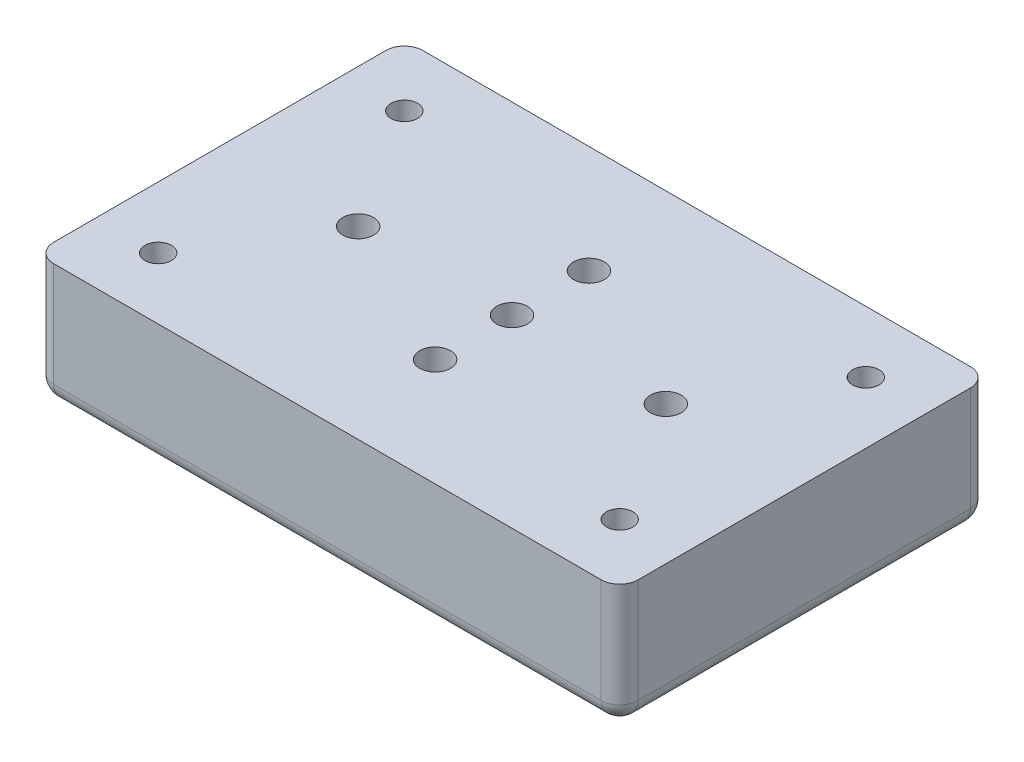
ISO-10303-21;
HEADER;
FILE_DESCRIPTION(('STEP AP214'),'2;1');
FILE_NAME('part.step','',(''),(''),'','','');
FILE_SCHEMA(('AUTOMOTIVE_DESIGN { 1 0 10303 214 1 1 1 1 }'));
ENDSEC;
DATA;
#1=APPLICATION_CONTEXT('core data for automotive mechanical design processes');
#2=APPLICATION_PROTOCOL_DEFINITION('international standard','automotive_design',2000,#1);
#3=PRODUCT_CONTEXT('',#1,'mechanical');
#4=PRODUCT('Part','Part','',(#3));
#5=PRODUCT_RELATED_PRODUCT_CATEGORY('part','',(#4));
#6=PRODUCT_DEFINITION_FORMATION('','',#4);
#7=PRODUCT_DEFINITION_CONTEXT('part definition',#1,'design');
#8=PRODUCT_DEFINITION('design','',#6,#7);
#9=PRODUCT_DEFINITION_SHAPE('','',#8);
#10=(LENGTH_UNIT() NAMED_UNIT(*) SI_UNIT(.MILLI.,.METRE.));
#11=(NAMED_UNIT(*) PLANE_ANGLE_UNIT() SI_UNIT($,.RADIAN.));
#12=(NAMED_UNIT(*) SI_UNIT($,.STERADIAN.) SOLID_ANGLE_UNIT());
#13=UNCERTAINTY_MEASURE_WITH_UNIT(LENGTH_MEASURE(1.E-05),#10,'distance_accuracy_value','');
#14=(GEOMETRIC_REPRESENTATION_CONTEXT(3) GLOBAL_UNCERTAINTY_ASSIGNED_CONTEXT((#13)) GLOBAL_UNIT_ASSIGNED_CONTEXT((#10,
#11,#12)) REPRESENTATION_CONTEXT('',''));
#15=CARTESIAN_POINT('',(0.,0.,0.));
#16=DIRECTION('',(0.,0.,1.));
#17=DIRECTION('',(1.,0.,0.));
#18=AXIS2_PLACEMENT_3D('',#15,#16,#17);
#19=CARTESIAN_POINT('',(-102.520594586842,20.,50.7506198442389));
#20=DIRECTION('',(1.,0.,0.));
#21=DIRECTION('',(0.,0.,-1.));
#22=AXIS2_PLACEMENT_3D('',#19,#20,#21);
#23=PLANE('',#22);
#24=DIRECTION('',(0.,0.,1.));
#25=VECTOR('',#24,1.);
#26=CARTESIAN_POINT('',(-102.520594586842,20.,50.7506198442389));
#27=LINE('',#26,#25);
#28=CARTESIAN_POINT('',(-102.520594586842,20.,53.7506198442389));
#29=VERTEX_POINT('',#28);
#30=CARTESIAN_POINT('',(-102.520594586842,20.,107.750619844239));
#31=VERTEX_POINT('',#30);
#32=EDGE_CURVE('E283',#29,#31,#27,.T.);
#33=ORIENTED_EDGE('',*,*,#32,.F.);
#34=DIRECTION('',(0.,-1.,0.));
#35=VECTOR('',#34,1.);
#36=CARTESIAN_POINT('',(-102.520594586842,20.,53.7506198442389));
#37=LINE('',#36,#35);
#38=CARTESIAN_POINT('',(-102.520594586842,3.,53.7506198442389));
#39=VERTEX_POINT('',#38);
#40=EDGE_CURVE('E155',#29,#39,#37,.T.);
#41=ORIENTED_EDGE('',*,*,#40,.T.);
#42=DIRECTION('',(0.,0.,1.));
#43=VECTOR('',#42,1.);
#44=CARTESIAN_POINT('',(-102.520594586842,3.,50.7506198442389));
#45=LINE('',#44,#43);
#46=CARTESIAN_POINT('',(-102.520594586842,3.,107.750619844239));
#47=VERTEX_POINT('',#46);
#48=EDGE_CURVE('E124',#39,#47,#45,.T.);
#49=ORIENTED_EDGE('',*,*,#48,.T.);
#50=DIRECTION('',(0.,-1.,0.));
#51=VECTOR('',#50,1.);
#52=CARTESIAN_POINT('',(-102.520594586842,20.,107.750619844239));
#53=LINE('',#52,#51);
#54=EDGE_CURVE('E153',#47,#31,#53,.F.);
#55=ORIENTED_EDGE('',*,*,#54,.T.);
#56=EDGE_LOOP('',(#33,#41,#49,#55));
#57=FACE_BOUND('',#56,.T.);
#58=ADVANCED_FACE('F33',(#57),#23,.F.);
#59=CARTESIAN_POINT('',(-102.520594586842,20.,110.750619844239));
#60=DIRECTION('',(0.,0.,-1.));
#61=DIRECTION('',(-1.,0.,0.));
#62=AXIS2_PLACEMENT_3D('',#59,#60,#61);
#63=PLANE('',#62);
#64=DIRECTION('',(1.,0.,0.));
#65=VECTOR('',#64,1.);
#66=CARTESIAN_POINT('',(-102.520594586842,3.,110.750619844239));
#67=LINE('',#66,#65);
#68=CARTESIAN_POINT('',(-99.520594586842,3.,110.750619844239));
#69=VERTEX_POINT('',#68);
#70=CARTESIAN_POINT('',(-10.520594586842,3.,110.750619844239));
#71=VERTEX_POINT('',#70);
#72=EDGE_CURVE('E157',#69,#71,#67,.T.);
#73=ORIENTED_EDGE('',*,*,#72,.T.);
#74=DIRECTION('',(0.,-1.,0.));
#75=VECTOR('',#74,1.);
#76=CARTESIAN_POINT('',(-10.520594586842,20.,110.750619844239));
#77=LINE('',#76,#75);
#78=CARTESIAN_POINT('',(-10.520594586842,20.,110.750619844239));
#79=VERTEX_POINT('',#78);
#80=EDGE_CURVE('E161',#71,#79,#77,.F.);
#81=ORIENTED_EDGE('',*,*,#80,.T.);
#82=DIRECTION('',(1.,0.,0.));
#83=VECTOR('',#82,1.);
#84=CARTESIAN_POINT('',(-102.520594586842,20.,110.750619844239));
#85=LINE('',#84,#83);
#86=CARTESIAN_POINT('',(-99.520594586842,20.,110.750619844239));
#87=VERTEX_POINT('',#86);
#88=EDGE_CURVE('E286',#87,#79,#85,.T.);
#89=ORIENTED_EDGE('',*,*,#88,.F.);
#90=DIRECTION('',(0.,-1.,0.));
#91=VECTOR('',#90,1.);
#92=CARTESIAN_POINT('',(-99.520594586842,20.,110.750619844239));
#93=LINE('',#92,#91);
#94=EDGE_CURVE('E159',#87,#69,#93,.T.);
#95=ORIENTED_EDGE('',*,*,#94,.T.);
#96=EDGE_LOOP('',(#73,#81,#89,#95));
#97=FACE_BOUND('',#96,.T.);
#98=ADVANCED_FACE('F313',(#97),#63,.F.);
#99=CARTESIAN_POINT('',(-7.52059458684204,20.,50.7506198442389));
#100=DIRECTION('',(-1.,0.,0.));
#101=DIRECTION('',(0.,0.,1.));
#102=AXIS2_PLACEMENT_3D('',#99,#100,#101);
#103=PLANE('',#102);
#104=DIRECTION('',(0.,0.,-1.));
#105=VECTOR('',#104,1.);
#106=CARTESIAN_POINT('',(-7.52059458684204,3.,50.7506198442389));
#107=LINE('',#106,#105);
#108=CARTESIAN_POINT('',(-7.52059458684201,3.,107.750619844239));
#109=VERTEX_POINT('',#108);
#110=CARTESIAN_POINT('',(-7.52059458684204,3.,53.7506198442389));
#111=VERTEX_POINT('',#110);
#112=EDGE_CURVE('E137',#109,#111,#107,.T.);
#113=ORIENTED_EDGE('',*,*,#112,.T.);
#114=DIRECTION('',(0.,-1.,0.));
#115=VECTOR('',#114,1.);
#116=CARTESIAN_POINT('',(-7.52059458684204,20.,53.7506198442389));
#117=LINE('',#116,#115);
#118=CARTESIAN_POINT('',(-7.52059458684204,20.,53.7506198442389));
#119=VERTEX_POINT('',#118);
#120=EDGE_CURVE('E145',#111,#119,#117,.F.);
#121=ORIENTED_EDGE('',*,*,#120,.T.);
#122=DIRECTION('',(0.,0.,-1.));
#123=VECTOR('',#122,1.);
#124=CARTESIAN_POINT('',(-7.52059458684204,20.,50.7506198442389));
#125=LINE('',#124,#123);
#126=CARTESIAN_POINT('',(-7.52059458684201,20.,107.750619844239));
#127=VERTEX_POINT('',#126);
#128=EDGE_CURVE('E120',#127,#119,#125,.T.);
#129=ORIENTED_EDGE('',*,*,#128,.F.);
#130=DIRECTION('',(0.,-1.,0.));
#131=VECTOR('',#130,1.);
#132=CARTESIAN_POINT('',(-7.52059458684201,20.,107.750619844239));
#133=LINE('',#132,#131);
#134=EDGE_CURVE('E139',#127,#109,#133,.T.);
#135=ORIENTED_EDGE('',*,*,#134,.T.);
#136=EDGE_LOOP('',(#113,#121,#129,#135));
#137=FACE_BOUND('',#136,.T.);
#138=ADVANCED_FACE('F330',(#137),#103,.F.);
#139=CARTESIAN_POINT('',(-102.520594586842,20.,50.7506198442389));
#140=DIRECTION('',(0.,0.,1.));
#141=DIRECTION('',(1.,0.,0.));
#142=AXIS2_PLACEMENT_3D('',#139,#140,#141);
#143=PLANE('',#142);
#144=DIRECTION('',(-1.,0.,0.));
#145=VECTOR('',#144,1.);
#146=CARTESIAN_POINT('',(-102.520594586842,20.,50.7506198442389));
#147=LINE('',#146,#145);
#148=CARTESIAN_POINT('',(-10.520594586842,20.,50.7506198442389));
#149=VERTEX_POINT('',#148);
#150=CARTESIAN_POINT('',(-99.520594586842,20.,50.7506198442389));
#151=VERTEX_POINT('',#150);
#152=EDGE_CURVE('E117',#149,#151,#147,.T.);
#153=ORIENTED_EDGE('',*,*,#152,.F.);
#154=DIRECTION('',(0.,-1.,0.));
#155=VECTOR('',#154,1.);
#156=CARTESIAN_POINT('',(-10.520594586842,20.,50.7506198442389));
#157=LINE('',#156,#155);
#158=CARTESIAN_POINT('',(-10.520594586842,3.,50.7506198442389));
#159=VERTEX_POINT('',#158);
#160=EDGE_CURVE('E130',#149,#159,#157,.T.);
#161=ORIENTED_EDGE('',*,*,#160,.T.);
#162=DIRECTION('',(-1.,0.,0.));
#163=VECTOR('',#162,1.);
#164=CARTESIAN_POINT('',(-102.520594586842,3.,50.7506198442389));
#165=LINE('',#164,#163);
#166=CARTESIAN_POINT('',(-99.520594586842,3.,50.7506198442389));
#167=VERTEX_POINT('',#166);
#168=EDGE_CURVE('E133',#159,#167,#165,.T.);
#169=ORIENTED_EDGE('',*,*,#168,.T.);
#170=DIRECTION('',(0.,-1.,0.));
#171=VECTOR('',#170,1.);
#172=CARTESIAN_POINT('',(-99.520594586842,20.,50.7506198442389));
#173=LINE('',#172,#171);
#174=EDGE_CURVE('E132',#167,#151,#173,.F.);
#175=ORIENTED_EDGE('',*,*,#174,.T.);
#176=EDGE_LOOP('',(#153,#161,#169,#175));
#177=FACE_BOUND('',#176,.T.);
#178=ADVANCED_FACE('F129',(#177),#143,.F.);
#179=CARTESIAN_POINT('',(0.,20.,0.));
#180=DIRECTION('',(0.,1.,0.));
#181=DIRECTION('',(0.,0.,1.));
#182=AXIS2_PLACEMENT_3D('',#179,#180,#181);
#183=PLANE('',#182);
#184=CARTESIAN_POINT('',(-30.020594586842,20.,80.7506198442389));
#185=DIRECTION('',(0.,-1.,0.));
#186=DIRECTION('',(0.,0.,-1.));
#187=AXIS2_PLACEMENT_3D('',#184,#185,#186);
#188=CIRCLE('',#187,2.5);
#189=CARTESIAN_POINT('',(-30.020594586842,20.,78.2506198442389));
#190=VERTEX_POINT('',#189);
#191=EDGE_CURVE('E204',#190,#190,#188,.T.);
#192=ORIENTED_EDGE('',*,*,#191,.T.);
#193=EDGE_LOOP('',(#192));
#194=FACE_BOUND('',#193,.T.);
#195=CARTESIAN_POINT('',(-55.020594586842,20.,80.7506198442389));
#196=DIRECTION('',(0.,-1.,0.));
#197=DIRECTION('',(0.,0.,-1.));
#198=AXIS2_PLACEMENT_3D('',#195,#196,#197);
#199=CIRCLE('',#198,2.5);
#200=CARTESIAN_POINT('',(-55.020594586842,20.,78.2506198442389));
#201=VERTEX_POINT('',#200);
#202=EDGE_CURVE('E214',#201,#201,#199,.T.);
#203=ORIENTED_EDGE('',*,*,#202,.T.);
#204=EDGE_LOOP('',(#203));
#205=FACE_BOUND('',#204,.T.);
#206=CARTESIAN_POINT('',(-80.020594586842,20.,80.7506198442389));
#207=DIRECTION('',(0.,-1.,0.));
#208=DIRECTION('',(0.,0.,-1.));
#209=AXIS2_PLACEMENT_3D('',#206,#207,#208);
#210=CIRCLE('',#209,2.5);
#211=CARTESIAN_POINT('',(-80.020594586842,20.,78.2506198442389));
#212=VERTEX_POINT('',#211);
#213=EDGE_CURVE('E220',#212,#212,#210,.T.);
#214=ORIENTED_EDGE('',*,*,#213,.T.);
#215=EDGE_LOOP('',(#214));
#216=FACE_BOUND('',#215,.T.);
#217=CARTESIAN_POINT('',(-55.020594586842,20.,68.2506198442389));
#218=DIRECTION('',(0.,-1.,0.));
#219=DIRECTION('',(0.,0.,-1.));
#220=AXIS2_PLACEMENT_3D('',#217,#218,#219);
#221=CIRCLE('',#220,2.5);
#222=CARTESIAN_POINT('',(-55.020594586842,20.,65.7506198442389));
#223=VERTEX_POINT('',#222);
#224=EDGE_CURVE('E226',#223,#223,#221,.T.);
#225=ORIENTED_EDGE('',*,*,#224,.T.);
#226=EDGE_LOOP('',(#225));
#227=FACE_BOUND('',#226,.T.);
#228=CARTESIAN_POINT('',(-55.020594586842,20.,93.2506198442389));
#229=DIRECTION('',(0.,-1.,0.));
#230=DIRECTION('',(0.,0.,-1.));
#231=AXIS2_PLACEMENT_3D('',#228,#229,#230);
#232=CIRCLE('',#231,2.5);
#233=CARTESIAN_POINT('',(-55.020594586842,20.,90.7506198442389));
#234=VERTEX_POINT('',#233);
#235=EDGE_CURVE('E232',#234,#234,#232,.T.);
#236=ORIENTED_EDGE('',*,*,#235,.T.);
#237=EDGE_LOOP('',(#236));
#238=FACE_BOUND('',#237,.T.);
#239=CARTESIAN_POINT('',(-17.520594586842,20.,60.7506198442389));
#240=DIRECTION('',(0.,-1.,0.));
#241=DIRECTION('',(0.,0.,-1.));
#242=AXIS2_PLACEMENT_3D('',#239,#240,#241);
#243=CIRCLE('',#242,2.15);
#244=CARTESIAN_POINT('',(-17.520594586842,20.,58.6006198442389));
#245=VERTEX_POINT('',#244);
#246=EDGE_CURVE('E244',#245,#245,#243,.T.);
#247=ORIENTED_EDGE('',*,*,#246,.T.);
#248=EDGE_LOOP('',(#247));
#249=FACE_BOUND('',#248,.T.);
#250=CARTESIAN_POINT('',(-92.5205945868421,20.,60.7506198442389));
#251=DIRECTION('',(0.,-1.,0.));
#252=DIRECTION('',(0.,0.,-1.));
#253=AXIS2_PLACEMENT_3D('',#250,#251,#252);
#254=CIRCLE('',#253,2.15);
#255=CARTESIAN_POINT('',(-92.5205945868421,20.,58.6006198442389));
#256=VERTEX_POINT('',#255);
#257=EDGE_CURVE('E256',#256,#256,#254,.T.);
#258=ORIENTED_EDGE('',*,*,#257,.T.);
#259=EDGE_LOOP('',(#258));
#260=FACE_BOUND('',#259,.T.);
#261=CARTESIAN_POINT('',(-92.5205945868421,20.,100.750619844239));
#262=DIRECTION('',(0.,-1.,0.));
#263=DIRECTION('',(0.,0.,-1.));
#264=AXIS2_PLACEMENT_3D('',#261,#262,#263);
#265=CIRCLE('',#264,2.15);
#266=CARTESIAN_POINT('',(-92.5205945868421,20.,98.6006198442389));
#267=VERTEX_POINT('',#266);
#268=EDGE_CURVE('E268',#267,#267,#265,.T.);
#269=ORIENTED_EDGE('',*,*,#268,.T.);
#270=EDGE_LOOP('',(#269));
#271=FACE_BOUND('',#270,.T.);
#272=CARTESIAN_POINT('',(-17.520594586842,20.,100.750619844239));
#273=DIRECTION('',(0.,-1.,0.));
#274=DIRECTION('',(0.,0.,-1.));
#275=AXIS2_PLACEMENT_3D('',#272,#273,#274);
#276=CIRCLE('',#275,2.15);
#277=CARTESIAN_POINT('',(-17.520594586842,20.,98.6006198442389));
#278=VERTEX_POINT('',#277);
#279=EDGE_CURVE('E280',#278,#278,#276,.T.);
#280=ORIENTED_EDGE('',*,*,#279,.T.);
#281=EDGE_LOOP('',(#280));
#282=FACE_BOUND('',#281,.T.);
#283=ORIENTED_EDGE('',*,*,#128,.T.);
#284=CARTESIAN_POINT('',(-10.520594586842,20.,53.7506198442389));
#285=DIRECTION('',(0.,1.,0.));
#286=DIRECTION('',(0.,0.,1.));
#287=AXIS2_PLACEMENT_3D('',#284,#285,#286);
#288=CIRCLE('',#287,3.);
#289=EDGE_CURVE('E114',#119,#149,#288,.T.);
#290=ORIENTED_EDGE('',*,*,#289,.T.);
#291=ORIENTED_EDGE('',*,*,#152,.T.);
#292=CARTESIAN_POINT('',(-99.520594586842,20.,53.7506198442389));
#293=DIRECTION('',(0.,1.,0.));
#294=DIRECTION('',(0.,0.,1.));
#295=AXIS2_PLACEMENT_3D('',#292,#293,#294);
#296=CIRCLE('',#295,3.);
#297=EDGE_CURVE('E125',#151,#29,#296,.T.);
#298=ORIENTED_EDGE('',*,*,#297,.T.);
#299=ORIENTED_EDGE('',*,*,#32,.T.);
#300=CARTESIAN_POINT('',(-99.520594586842,20.,107.750619844239));
#301=DIRECTION('',(0.,1.,0.));
#302=DIRECTION('',(0.,0.,1.));
#303=AXIS2_PLACEMENT_3D('',#300,#301,#302);
#304=CIRCLE('',#303,3.);
#305=EDGE_CURVE('E147',#31,#87,#304,.T.);
#306=ORIENTED_EDGE('',*,*,#305,.T.);
#307=ORIENTED_EDGE('',*,*,#88,.T.);
#308=CARTESIAN_POINT('',(-10.520594586842,20.,107.750619844239));
#309=DIRECTION('',(0.,1.,0.));
#310=DIRECTION('',(0.,0.,1.));
#311=AXIS2_PLACEMENT_3D('',#308,#309,#310);
#312=CIRCLE('',#311,3.);
#313=EDGE_CURVE('E149',#79,#127,#312,.T.);
#314=ORIENTED_EDGE('',*,*,#313,.T.);
#315=EDGE_LOOP('',(#283,#290,#291,#298,#299,#306,#307,#314));
#316=FACE_BOUND('',#315,.T.);
#317=ADVANCED_FACE('F116',(#194,#205,#216,#227,#238,#249,#260,#271,#282,#316),#183,.T.);
#318=CARTESIAN_POINT('',(0.,0.,0.));
#319=DIRECTION('',(0.,1.,0.));
#320=DIRECTION('',(0.,0.,1.));
#321=AXIS2_PLACEMENT_3D('',#318,#319,#320);
#322=PLANE('',#321);
#323=DIRECTION('',(0.,0.,1.));
#324=VECTOR('',#323,1.);
#325=CARTESIAN_POINT('',(-99.520594586842,0.,0.));
#326=LINE('',#325,#324);
#327=CARTESIAN_POINT('',(-99.520594586842,0.,107.750619844239));
#328=VERTEX_POINT('',#327);
#329=CARTESIAN_POINT('',(-99.520594586842,0.,53.7506198442389));
#330=VERTEX_POINT('',#329);
#331=EDGE_CURVE('E163',#328,#330,#326,.F.);
#332=ORIENTED_EDGE('',*,*,#331,.T.);
#333=DIRECTION('',(-1.,0.,0.));
#334=VECTOR('',#333,1.);
#335=CARTESIAN_POINT('',(0.,0.,53.7506198442389));
#336=LINE('',#335,#334);
#337=CARTESIAN_POINT('',(-10.520594586842,0.,53.7506198442389));
#338=VERTEX_POINT('',#337);
#339=EDGE_CURVE('E11',#330,#338,#336,.F.);
#340=ORIENTED_EDGE('',*,*,#339,.T.);
#341=DIRECTION('',(0.,0.,-1.));
#342=VECTOR('',#341,1.);
#343=CARTESIAN_POINT('',(-10.5205945868421,0.,0.));
#344=LINE('',#343,#342);
#345=CARTESIAN_POINT('',(-10.520594586842,0.,107.750619844239));
#346=VERTEX_POINT('',#345);
#347=EDGE_CURVE('E42',#338,#346,#344,.F.);
#348=ORIENTED_EDGE('',*,*,#347,.T.);
#349=DIRECTION('',(1.,0.,0.));
#350=VECTOR('',#349,1.);
#351=CARTESIAN_POINT('',(0.,0.,107.750619844239));
#352=LINE('',#351,#350);
#353=EDGE_CURVE('E165',#346,#328,#352,.F.);
#354=ORIENTED_EDGE('',*,*,#353,.T.);
#355=EDGE_LOOP('',(#332,#340,#348,#354));
#356=FACE_BOUND('',#355,.T.);
#357=CARTESIAN_POINT('',(-30.020594586842,0.,80.7506198442389));
#358=DIRECTION('',(0.,-1.,0.));
#359=DIRECTION('',(0.,0.,-1.));
#360=AXIS2_PLACEMENT_3D('',#357,#358,#359);
#361=CIRCLE('',#360,2.5);
#362=CARTESIAN_POINT('',(-30.020594586842,0.,78.2506198442389));
#363=VERTEX_POINT('',#362);
#364=EDGE_CURVE('E199',#363,#363,#361,.T.);
#365=ORIENTED_EDGE('',*,*,#364,.F.);
#366=EDGE_LOOP('',(#365));
#367=FACE_BOUND('',#366,.T.);
#368=CARTESIAN_POINT('',(-55.020594586842,0.,80.7506198442389));
#369=DIRECTION('',(0.,-1.,0.));
#370=DIRECTION('',(0.,0.,-1.));
#371=AXIS2_PLACEMENT_3D('',#368,#369,#370);
#372=CIRCLE('',#371,2.5);
#373=CARTESIAN_POINT('',(-55.020594586842,0.,78.2506198442389));
#374=VERTEX_POINT('',#373);
#375=EDGE_CURVE('E209',#374,#374,#372,.T.);
#376=ORIENTED_EDGE('',*,*,#375,.F.);
#377=EDGE_LOOP('',(#376));
#378=FACE_BOUND('',#377,.T.);
#379=CARTESIAN_POINT('',(-80.020594586842,0.,80.7506198442389));
#380=DIRECTION('',(0.,-1.,0.));
#381=DIRECTION('',(0.,0.,-1.));
#382=AXIS2_PLACEMENT_3D('',#379,#380,#381);
#383=CIRCLE('',#382,2.5);
#384=CARTESIAN_POINT('',(-80.020594586842,0.,78.2506198442389));
#385=VERTEX_POINT('',#384);
#386=EDGE_CURVE('E217',#385,#385,#383,.T.);
#387=ORIENTED_EDGE('',*,*,#386,.F.);
#388=EDGE_LOOP('',(#387));
#389=FACE_BOUND('',#388,.T.);
#390=CARTESIAN_POINT('',(-55.020594586842,0.,68.2506198442389));
#391=DIRECTION('',(0.,-1.,0.));
#392=DIRECTION('',(0.,0.,-1.));
#393=AXIS2_PLACEMENT_3D('',#390,#391,#392);
#394=CIRCLE('',#393,2.5);
#395=CARTESIAN_POINT('',(-55.020594586842,0.,65.7506198442389));
#396=VERTEX_POINT('',#395);
#397=EDGE_CURVE('E223',#396,#396,#394,.T.);
#398=ORIENTED_EDGE('',*,*,#397,.F.);
#399=EDGE_LOOP('',(#398));
#400=FACE_BOUND('',#399,.T.);
#401=CARTESIAN_POINT('',(-55.020594586842,0.,93.2506198442389));
#402=DIRECTION('',(0.,-1.,0.));
#403=DIRECTION('',(0.,0.,-1.));
#404=AXIS2_PLACEMENT_3D('',#401,#402,#403);
#405=CIRCLE('',#404,2.5);
#406=CARTESIAN_POINT('',(-55.020594586842,0.,90.7506198442389));
#407=VERTEX_POINT('',#406);
#408=EDGE_CURVE('E229',#407,#407,#405,.T.);
#409=ORIENTED_EDGE('',*,*,#408,.F.);
#410=EDGE_LOOP('',(#409));
#411=FACE_BOUND('',#410,.T.);
#412=CARTESIAN_POINT('',(-17.520594586842,0.,60.7506198442389));
#413=DIRECTION('',(0.,-1.,0.));
#414=DIRECTION('',(0.,0.,-1.));
#415=AXIS2_PLACEMENT_3D('',#412,#413,#414);
#416=CIRCLE('',#415,3.6);
#417=CARTESIAN_POINT('',(-17.520594586842,0.,57.1506198442389));
#418=VERTEX_POINT('',#417);
#419=EDGE_CURVE('E235',#418,#418,#416,.T.);
#420=ORIENTED_EDGE('',*,*,#419,.F.);
#421=EDGE_LOOP('',(#420));
#422=FACE_BOUND('',#421,.T.);
#423=CARTESIAN_POINT('',(-92.5205945868421,0.,60.7506198442389));
#424=DIRECTION('',(0.,-1.,0.));
#425=DIRECTION('',(0.,0.,-1.));
#426=AXIS2_PLACEMENT_3D('',#423,#424,#425);
#427=CIRCLE('',#426,3.60000000000001);
#428=CARTESIAN_POINT('',(-92.5205945868421,0.,57.1506198442389));
#429=VERTEX_POINT('',#428);
#430=EDGE_CURVE('E247',#429,#429,#427,.T.);
#431=ORIENTED_EDGE('',*,*,#430,.F.);
#432=EDGE_LOOP('',(#431));
#433=FACE_BOUND('',#432,.T.);
#434=CARTESIAN_POINT('',(-92.5205945868421,0.,100.750619844239));
#435=DIRECTION('',(0.,-1.,0.));
#436=DIRECTION('',(0.,0.,-1.));
#437=AXIS2_PLACEMENT_3D('',#434,#435,#436);
#438=CIRCLE('',#437,3.60000000000001);
#439=CARTESIAN_POINT('',(-92.5205945868421,0.,97.1506198442389));
#440=VERTEX_POINT('',#439);
#441=EDGE_CURVE('E259',#440,#440,#438,.T.);
#442=ORIENTED_EDGE('',*,*,#441,.F.);
#443=EDGE_LOOP('',(#442));
#444=FACE_BOUND('',#443,.T.);
#445=CARTESIAN_POINT('',(-17.520594586842,0.,100.750619844239));
#446=DIRECTION('',(0.,-1.,0.));
#447=DIRECTION('',(0.,0.,-1.));
#448=AXIS2_PLACEMENT_3D('',#445,#446,#447);
#449=CIRCLE('',#448,3.6);
#450=CARTESIAN_POINT('',(-17.520594586842,0.,97.1506198442389));
#451=VERTEX_POINT('',#450);
#452=EDGE_CURVE('E271',#451,#451,#449,.T.);
#453=ORIENTED_EDGE('',*,*,#452,.F.);
#454=EDGE_LOOP('',(#453));
#455=FACE_BOUND('',#454,.T.);
#456=ADVANCED_FACE('F301',(#356,#367,#378,#389,#400,#411,#422,#433,#444,#455),#322,.F.);
#457=CARTESIAN_POINT('',(-17.520594586842,0.,100.750619844239));
#458=DIRECTION('',(0.,-1.,0.));
#459=DIRECTION('',(0.,0.,-1.));
#460=AXIS2_PLACEMENT_3D('',#457,#458,#459);
#461=CYLINDRICAL_SURFACE('',#460,2.15);
#462=ORIENTED_EDGE('',*,*,#279,.F.);
#463=EDGE_LOOP('',(#462));
#464=FACE_BOUND('',#463,.T.);
#465=CARTESIAN_POINT('',(-17.520594586842,4.,100.750619844239));
#466=DIRECTION('',(0.,-1.,0.));
#467=DIRECTION('',(0.,0.,-1.));
#468=AXIS2_PLACEMENT_3D('',#465,#466,#467);
#469=CIRCLE('',#468,2.15);
#470=CARTESIAN_POINT('',(-17.520594586842,4.,98.6006198442389));
#471=VERTEX_POINT('',#470);
#472=EDGE_CURVE('E277',#471,#471,#469,.T.);
#473=ORIENTED_EDGE('',*,*,#472,.T.);
#474=EDGE_LOOP('',(#473));
#475=FACE_BOUND('',#474,.T.);
#476=ADVANCED_FACE('F353',(#464,#475),#461,.F.);
#477=CARTESIAN_POINT('',(-15.370594586842,4.,100.750619844239));
#478=DIRECTION('',(0.,1.,0.));
#479=DIRECTION('',(0.,0.,1.));
#480=AXIS2_PLACEMENT_3D('',#477,#478,#479);
#481=PLANE('',#480);
#482=ORIENTED_EDGE('',*,*,#472,.F.);
#483=EDGE_LOOP('',(#482));
#484=FACE_BOUND('',#483,.T.);
#485=CARTESIAN_POINT('',(-17.520594586842,4.,100.750619844239));
#486=DIRECTION('',(0.,-1.,0.));
#487=DIRECTION('',(0.,0.,-1.));
#488=AXIS2_PLACEMENT_3D('',#485,#486,#487);
#489=CIRCLE('',#488,3.6);
#490=CARTESIAN_POINT('',(-17.520594586842,4.,97.1506198442389));
#491=VERTEX_POINT('',#490);
#492=EDGE_CURVE('E274',#491,#491,#489,.T.);
#493=ORIENTED_EDGE('',*,*,#492,.T.);
#494=EDGE_LOOP('',(#493));
#495=FACE_BOUND('',#494,.T.);
#496=ADVANCED_FACE('F359',(#484,#495),#481,.F.);
#497=CARTESIAN_POINT('',(-17.520594586842,0.,100.750619844239));
#498=DIRECTION('',(0.,-1.,0.));
#499=DIRECTION('',(0.,0.,-1.));
#500=AXIS2_PLACEMENT_3D('',#497,#498,#499);
#501=CYLINDRICAL_SURFACE('',#500,3.6);
#502=ORIENTED_EDGE('',*,*,#492,.F.);
#503=EDGE_LOOP('',(#502));
#504=FACE_BOUND('',#503,.T.);
#505=ORIENTED_EDGE('',*,*,#452,.T.);
#506=EDGE_LOOP('',(#505));
#507=FACE_BOUND('',#506,.T.);
#508=ADVANCED_FACE('F363',(#504,#507),#501,.F.);
#509=CARTESIAN_POINT('',(-92.5205945868421,0.,100.750619844239));
#510=DIRECTION('',(0.,-1.,0.));
#511=DIRECTION('',(0.,0.,-1.));
#512=AXIS2_PLACEMENT_3D('',#509,#510,#511);
#513=CYLINDRICAL_SURFACE('',#512,2.15);
#514=ORIENTED_EDGE('',*,*,#268,.F.);
#515=EDGE_LOOP('',(#514));
#516=FACE_BOUND('',#515,.T.);
#517=CARTESIAN_POINT('',(-92.5205945868421,4.,100.750619844239));
#518=DIRECTION('',(0.,-1.,0.));
#519=DIRECTION('',(0.,0.,-1.));
#520=AXIS2_PLACEMENT_3D('',#517,#518,#519);
#521=CIRCLE('',#520,2.15);
#522=CARTESIAN_POINT('',(-92.5205945868421,4.,98.6006198442389));
#523=VERTEX_POINT('',#522);
#524=EDGE_CURVE('E265',#523,#523,#521,.T.);
#525=ORIENTED_EDGE('',*,*,#524,.T.);
#526=EDGE_LOOP('',(#525));
#527=FACE_BOUND('',#526,.T.);
#528=ADVANCED_FACE('F367',(#516,#527),#513,.F.);
#529=CARTESIAN_POINT('',(-90.370594586842,4.,100.750619844239));
#530=DIRECTION('',(0.,1.,0.));
#531=DIRECTION('',(0.,0.,1.));
#532=AXIS2_PLACEMENT_3D('',#529,#530,#531);
#533=PLANE('',#532);
#534=ORIENTED_EDGE('',*,*,#524,.F.);
#535=EDGE_LOOP('',(#534));
#536=FACE_BOUND('',#535,.T.);
#537=CARTESIAN_POINT('',(-92.5205945868421,4.,100.750619844239));
#538=DIRECTION('',(0.,-1.,0.));
#539=DIRECTION('',(0.,0.,-1.));
#540=AXIS2_PLACEMENT_3D('',#537,#538,#539);
#541=CIRCLE('',#540,3.60000000000001);
#542=CARTESIAN_POINT('',(-92.5205945868421,4.,97.1506198442389));
#543=VERTEX_POINT('',#542);
#544=EDGE_CURVE('E262',#543,#543,#541,.T.);
#545=ORIENTED_EDGE('',*,*,#544,.T.);
#546=EDGE_LOOP('',(#545));
#547=FACE_BOUND('',#546,.T.);
#548=ADVANCED_FACE('F371',(#536,#547),#533,.F.);
#549=CARTESIAN_POINT('',(-92.5205945868421,0.,100.750619844239));
#550=DIRECTION('',(0.,-1.,0.));
#551=DIRECTION('',(0.,0.,-1.));
#552=AXIS2_PLACEMENT_3D('',#549,#550,#551);
#553=CYLINDRICAL_SURFACE('',#552,3.60000000000001);
#554=ORIENTED_EDGE('',*,*,#544,.F.);
#555=EDGE_LOOP('',(#554));
#556=FACE_BOUND('',#555,.T.);
#557=ORIENTED_EDGE('',*,*,#441,.T.);
#558=EDGE_LOOP('',(#557));
#559=FACE_BOUND('',#558,.T.);
#560=ADVANCED_FACE('F375',(#556,#559),#553,.F.);
#561=CARTESIAN_POINT('',(-92.5205945868421,0.,60.7506198442389));
#562=DIRECTION('',(0.,-1.,0.));
#563=DIRECTION('',(0.,0.,-1.));
#564=AXIS2_PLACEMENT_3D('',#561,#562,#563);
#565=CYLINDRICAL_SURFACE('',#564,2.15);
#566=ORIENTED_EDGE('',*,*,#257,.F.);
#567=EDGE_LOOP('',(#566));
#568=FACE_BOUND('',#567,.T.);
#569=CARTESIAN_POINT('',(-92.5205945868421,4.,60.7506198442389));
#570=DIRECTION('',(0.,-1.,0.));
#571=DIRECTION('',(0.,0.,-1.));
#572=AXIS2_PLACEMENT_3D('',#569,#570,#571);
#573=CIRCLE('',#572,2.15);
#574=CARTESIAN_POINT('',(-92.5205945868421,4.,58.6006198442389));
#575=VERTEX_POINT('',#574);
#576=EDGE_CURVE('E253',#575,#575,#573,.T.);
#577=ORIENTED_EDGE('',*,*,#576,.T.);
#578=EDGE_LOOP('',(#577));
#579=FACE_BOUND('',#578,.T.);
#580=ADVANCED_FACE('F379',(#568,#579),#565,.F.);
#581=CARTESIAN_POINT('',(-90.370594586842,4.,60.7506198442389));
#582=DIRECTION('',(0.,1.,0.));
#583=DIRECTION('',(0.,0.,1.));
#584=AXIS2_PLACEMENT_3D('',#581,#582,#583);
#585=PLANE('',#584);
#586=ORIENTED_EDGE('',*,*,#576,.F.);
#587=EDGE_LOOP('',(#586));
#588=FACE_BOUND('',#587,.T.);
#589=CARTESIAN_POINT('',(-92.5205945868421,4.,60.7506198442389));
#590=DIRECTION('',(0.,-1.,0.));
#591=DIRECTION('',(0.,0.,-1.));
#592=AXIS2_PLACEMENT_3D('',#589,#590,#591);
#593=CIRCLE('',#592,3.60000000000001);
#594=CARTESIAN_POINT('',(-92.5205945868421,4.,57.1506198442389));
#595=VERTEX_POINT('',#594);
#596=EDGE_CURVE('E250',#595,#595,#593,.T.);
#597=ORIENTED_EDGE('',*,*,#596,.T.);
#598=EDGE_LOOP('',(#597));
#599=FACE_BOUND('',#598,.T.);
#600=ADVANCED_FACE('F383',(#588,#599),#585,.F.);
#601=CARTESIAN_POINT('',(-92.5205945868421,0.,60.7506198442389));
#602=DIRECTION('',(0.,-1.,0.));
#603=DIRECTION('',(0.,0.,-1.));
#604=AXIS2_PLACEMENT_3D('',#601,#602,#603);
#605=CYLINDRICAL_SURFACE('',#604,3.60000000000001);
#606=ORIENTED_EDGE('',*,*,#596,.F.);
#607=EDGE_LOOP('',(#606));
#608=FACE_BOUND('',#607,.T.);
#609=ORIENTED_EDGE('',*,*,#430,.T.);
#610=EDGE_LOOP('',(#609));
#611=FACE_BOUND('',#610,.T.);
#612=ADVANCED_FACE('F387',(#608,#611),#605,.F.);
#613=CARTESIAN_POINT('',(-17.520594586842,0.,60.7506198442389));
#614=DIRECTION('',(0.,-1.,0.));
#615=DIRECTION('',(0.,0.,-1.));
#616=AXIS2_PLACEMENT_3D('',#613,#614,#615);
#617=CYLINDRICAL_SURFACE('',#616,2.15);
#618=ORIENTED_EDGE('',*,*,#246,.F.);
#619=EDGE_LOOP('',(#618));
#620=FACE_BOUND('',#619,.T.);
#621=CARTESIAN_POINT('',(-17.520594586842,4.,60.7506198442389));
#622=DIRECTION('',(0.,-1.,0.));
#623=DIRECTION('',(0.,0.,-1.));
#624=AXIS2_PLACEMENT_3D('',#621,#622,#623);
#625=CIRCLE('',#624,2.15);
#626=CARTESIAN_POINT('',(-17.520594586842,4.,58.6006198442389));
#627=VERTEX_POINT('',#626);
#628=EDGE_CURVE('E241',#627,#627,#625,.T.);
#629=ORIENTED_EDGE('',*,*,#628,.T.);
#630=EDGE_LOOP('',(#629));
#631=FACE_BOUND('',#630,.T.);
#632=ADVANCED_FACE('F391',(#620,#631),#617,.F.);
#633=CARTESIAN_POINT('',(-15.370594586842,4.,60.7506198442389));
#634=DIRECTION('',(0.,1.,0.));
#635=DIRECTION('',(0.,0.,1.));
#636=AXIS2_PLACEMENT_3D('',#633,#634,#635);
#637=PLANE('',#636);
#638=ORIENTED_EDGE('',*,*,#628,.F.);
#639=EDGE_LOOP('',(#638));
#640=FACE_BOUND('',#639,.T.);
#641=CARTESIAN_POINT('',(-17.520594586842,4.,60.7506198442389));
#642=DIRECTION('',(0.,-1.,0.));
#643=DIRECTION('',(0.,0.,-1.));
#644=AXIS2_PLACEMENT_3D('',#641,#642,#643);
#645=CIRCLE('',#644,3.6);
#646=CARTESIAN_POINT('',(-17.520594586842,4.,57.1506198442389));
#647=VERTEX_POINT('',#646);
#648=EDGE_CURVE('E238',#647,#647,#645,.T.);
#649=ORIENTED_EDGE('',*,*,#648,.T.);
#650=EDGE_LOOP('',(#649));
#651=FACE_BOUND('',#650,.T.);
#652=ADVANCED_FACE('F395',(#640,#651),#637,.F.);
#653=CARTESIAN_POINT('',(-17.520594586842,0.,60.7506198442389));
#654=DIRECTION('',(0.,-1.,0.));
#655=DIRECTION('',(0.,0.,-1.));
#656=AXIS2_PLACEMENT_3D('',#653,#654,#655);
#657=CYLINDRICAL_SURFACE('',#656,3.6);
#658=ORIENTED_EDGE('',*,*,#648,.F.);
#659=EDGE_LOOP('',(#658));
#660=FACE_BOUND('',#659,.T.);
#661=ORIENTED_EDGE('',*,*,#419,.T.);
#662=EDGE_LOOP('',(#661));
#663=FACE_BOUND('',#662,.T.);
#664=ADVANCED_FACE('F399',(#660,#663),#657,.F.);
#665=CARTESIAN_POINT('',(-55.020594586842,0.,93.2506198442389));
#666=DIRECTION('',(0.,-1.,0.));
#667=DIRECTION('',(0.,0.,-1.));
#668=AXIS2_PLACEMENT_3D('',#665,#666,#667);
#669=CYLINDRICAL_SURFACE('',#668,2.5);
#670=ORIENTED_EDGE('',*,*,#235,.F.);
#671=EDGE_LOOP('',(#670));
#672=FACE_BOUND('',#671,.T.);
#673=ORIENTED_EDGE('',*,*,#408,.T.);
#674=EDGE_LOOP('',(#673));
#675=FACE_BOUND('',#674,.T.);
#676=ADVANCED_FACE('F403',(#672,#675),#669,.F.);
#677=CARTESIAN_POINT('',(-55.020594586842,0.,68.2506198442389));
#678=DIRECTION('',(0.,-1.,0.));
#679=DIRECTION('',(0.,0.,-1.));
#680=AXIS2_PLACEMENT_3D('',#677,#678,#679);
#681=CYLINDRICAL_SURFACE('',#680,2.5);
#682=ORIENTED_EDGE('',*,*,#224,.F.);
#683=EDGE_LOOP('',(#682));
#684=FACE_BOUND('',#683,.T.);
#685=ORIENTED_EDGE('',*,*,#397,.T.);
#686=EDGE_LOOP('',(#685));
#687=FACE_BOUND('',#686,.T.);
#688=ADVANCED_FACE('F407',(#684,#687),#681,.F.);
#689=CARTESIAN_POINT('',(-80.020594586842,0.,80.7506198442389));
#690=DIRECTION('',(0.,-1.,0.));
#691=DIRECTION('',(0.,0.,-1.));
#692=AXIS2_PLACEMENT_3D('',#689,#690,#691);
#693=CYLINDRICAL_SURFACE('',#692,2.5);
#694=ORIENTED_EDGE('',*,*,#213,.F.);
#695=EDGE_LOOP('',(#694));
#696=FACE_BOUND('',#695,.T.);
#697=ORIENTED_EDGE('',*,*,#386,.T.);
#698=EDGE_LOOP('',(#697));
#699=FACE_BOUND('',#698,.T.);
#700=ADVANCED_FACE('F411',(#696,#699),#693,.F.);
#701=CARTESIAN_POINT('',(-55.020594586842,0.,80.7506198442389));
#702=DIRECTION('',(0.,-1.,0.));
#703=DIRECTION('',(0.,0.,-1.));
#704=AXIS2_PLACEMENT_3D('',#701,#702,#703);
#705=CYLINDRICAL_SURFACE('',#704,2.5);
#706=ORIENTED_EDGE('',*,*,#202,.F.);
#707=EDGE_LOOP('',(#706));
#708=FACE_BOUND('',#707,.T.);
#709=ORIENTED_EDGE('',*,*,#375,.T.);
#710=EDGE_LOOP('',(#709));
#711=FACE_BOUND('',#710,.T.);
#712=ADVANCED_FACE('F415',(#708,#711),#705,.F.);
#713=CARTESIAN_POINT('',(-30.020594586842,0.,80.7506198442389));
#714=DIRECTION('',(0.,-1.,0.));
#715=DIRECTION('',(0.,0.,-1.));
#716=AXIS2_PLACEMENT_3D('',#713,#714,#715);
#717=CYLINDRICAL_SURFACE('',#716,2.5);
#718=ORIENTED_EDGE('',*,*,#191,.F.);
#719=EDGE_LOOP('',(#718));
#720=FACE_BOUND('',#719,.T.);
#721=ORIENTED_EDGE('',*,*,#364,.T.);
#722=EDGE_LOOP('',(#721));
#723=FACE_BOUND('',#722,.T.);
#724=ADVANCED_FACE('F419',(#720,#723),#717,.F.);
#725=CARTESIAN_POINT('',(-99.520594586842,20.,107.750619844239));
#726=DIRECTION('',(0.,-1.,0.));
#727=DIRECTION('',(0.,0.,-1.));
#728=AXIS2_PLACEMENT_3D('',#725,#726,#727);
#729=CYLINDRICAL_SURFACE('',#728,3.);
#730=CARTESIAN_POINT('',(-99.520594586842,3.,107.750619844239));
#731=DIRECTION('',(0.,-1.,0.));
#732=DIRECTION('',(0.,0.,-1.));
#733=AXIS2_PLACEMENT_3D('',#730,#731,#732);
#734=CIRCLE('',#733,3.);
#735=EDGE_CURVE('E37',#69,#47,#734,.T.);
#736=ORIENTED_EDGE('',*,*,#735,.F.);
#737=ORIENTED_EDGE('',*,*,#94,.F.);
#738=ORIENTED_EDGE('',*,*,#305,.F.);
#739=ORIENTED_EDGE('',*,*,#54,.F.);
#740=EDGE_LOOP('',(#736,#737,#738,#739));
#741=FACE_BOUND('',#740,.T.);
#742=ADVANCED_FACE('F35',(#741),#729,.T.);
#743=CARTESIAN_POINT('',(-99.520594586842,3.,107.750619844239));
#744=DIRECTION('',(0.,0.,1.));
#745=DIRECTION('',(1.,0.,0.));
#746=AXIS2_PLACEMENT_3D('',#743,#744,#745);
#747=SPHERICAL_SURFACE('',#746,3.);
#748=CARTESIAN_POINT('',(-99.520594586842,3.,107.750619844239));
#749=DIRECTION('',(-1.,0.,0.));
#750=DIRECTION('',(0.,0.,1.));
#751=AXIS2_PLACEMENT_3D('',#748,#749,#750);
#752=CIRCLE('',#751,3.);
#753=EDGE_CURVE('E190',#69,#328,#752,.F.);
#754=ORIENTED_EDGE('',*,*,#753,.F.);
#755=ORIENTED_EDGE('',*,*,#735,.T.);
#756=CARTESIAN_POINT('',(-99.520594586842,3.,107.750619844239));
#757=DIRECTION('',(0.,0.,1.));
#758=DIRECTION('',(1.,0.,0.));
#759=AXIS2_PLACEMENT_3D('',#756,#757,#758);
#760=CIRCLE('',#759,3.);
#761=EDGE_CURVE('E192',#328,#47,#760,.F.);
#762=ORIENTED_EDGE('',*,*,#761,.F.);
#763=EDGE_LOOP('',(#754,#755,#762));
#764=FACE_BOUND('',#763,.T.);
#765=ADVANCED_FACE('F426',(#764),#747,.T.);
#766=CARTESIAN_POINT('',(-99.520594586842,20.,53.7506198442389));
#767=DIRECTION('',(0.,-1.,0.));
#768=DIRECTION('',(0.,0.,-1.));
#769=AXIS2_PLACEMENT_3D('',#766,#767,#768);
#770=CYLINDRICAL_SURFACE('',#769,3.);
#771=ORIENTED_EDGE('',*,*,#297,.F.);
#772=ORIENTED_EDGE('',*,*,#174,.F.);
#773=CARTESIAN_POINT('',(-99.520594586842,3.,53.7506198442389));
#774=DIRECTION('',(0.,-1.,0.));
#775=DIRECTION('',(0.,0.,-1.));
#776=AXIS2_PLACEMENT_3D('',#773,#774,#775);
#777=CIRCLE('',#776,3.);
#778=EDGE_CURVE('E187',#39,#167,#777,.T.);
#779=ORIENTED_EDGE('',*,*,#778,.F.);
#780=ORIENTED_EDGE('',*,*,#40,.F.);
#781=EDGE_LOOP('',(#771,#772,#779,#780));
#782=FACE_BOUND('',#781,.T.);
#783=ADVANCED_FACE('F293',(#782),#770,.T.);
#784=CARTESIAN_POINT('',(-99.520594586842,3.,50.7506198442389));
#785=DIRECTION('',(0.,0.,1.));
#786=DIRECTION('',(1.,0.,0.));
#787=AXIS2_PLACEMENT_3D('',#784,#785,#786);
#788=CYLINDRICAL_SURFACE('',#787,3.);
#789=ORIENTED_EDGE('',*,*,#761,.T.);
#790=ORIENTED_EDGE('',*,*,#48,.F.);
#791=CARTESIAN_POINT('',(-99.520594586842,3.,53.7506198442389));
#792=DIRECTION('',(0.,0.,-1.));
#793=DIRECTION('',(-1.,0.,0.));
#794=AXIS2_PLACEMENT_3D('',#791,#792,#793);
#795=CIRCLE('',#794,3.);
#796=EDGE_CURVE('E184',#330,#39,#795,.T.);
#797=ORIENTED_EDGE('',*,*,#796,.F.);
#798=ORIENTED_EDGE('',*,*,#331,.F.);
#799=EDGE_LOOP('',(#789,#790,#797,#798));
#800=FACE_BOUND('',#799,.T.);
#801=ADVANCED_FACE('F303',(#800),#788,.T.);
#802=CARTESIAN_POINT('',(-102.520594586842,3.,107.750619844239));
#803=DIRECTION('',(1.,0.,0.));
#804=DIRECTION('',(0.,0.,-1.));
#805=AXIS2_PLACEMENT_3D('',#802,#803,#804);
#806=CYLINDRICAL_SURFACE('',#805,3.);
#807=ORIENTED_EDGE('',*,*,#753,.T.);
#808=ORIENTED_EDGE('',*,*,#353,.F.);
#809=CARTESIAN_POINT('',(-10.520594586842,3.,107.750619844239));
#810=DIRECTION('',(1.,0.,0.));
#811=DIRECTION('',(0.,0.,-1.));
#812=AXIS2_PLACEMENT_3D('',#809,#810,#811);
#813=CIRCLE('',#812,3.);
#814=EDGE_CURVE('E181',#71,#346,#813,.T.);
#815=ORIENTED_EDGE('',*,*,#814,.F.);
#816=ORIENTED_EDGE('',*,*,#72,.F.);
#817=EDGE_LOOP('',(#807,#808,#815,#816));
#818=FACE_BOUND('',#817,.T.);
#819=ADVANCED_FACE('F323',(#818),#806,.T.);
#820=CARTESIAN_POINT('',(-10.520594586842,20.,107.750619844239));
#821=DIRECTION('',(0.,-1.,0.));
#822=DIRECTION('',(0.,0.,-1.));
#823=AXIS2_PLACEMENT_3D('',#820,#821,#822);
#824=CYLINDRICAL_SURFACE('',#823,3.);
#825=ORIENTED_EDGE('',*,*,#313,.F.);
#826=ORIENTED_EDGE('',*,*,#80,.F.);
#827=CARTESIAN_POINT('',(-10.520594586842,3.,107.750619844239));
#828=DIRECTION('',(0.,-1.,0.));
#829=DIRECTION('',(0.,0.,-1.));
#830=AXIS2_PLACEMENT_3D('',#827,#828,#829);
#831=CIRCLE('',#830,3.);
#832=EDGE_CURVE('E178',#109,#71,#831,.T.);
#833=ORIENTED_EDGE('',*,*,#832,.F.);
#834=ORIENTED_EDGE('',*,*,#134,.F.);
#835=EDGE_LOOP('',(#825,#826,#833,#834));
#836=FACE_BOUND('',#835,.T.);
#837=ADVANCED_FACE('F319',(#836),#824,.T.);
#838=CARTESIAN_POINT('',(-99.520594586842,3.,53.7506198442389));
#839=DIRECTION('',(0.,0.,1.));
#840=DIRECTION('',(1.,0.,0.));
#841=AXIS2_PLACEMENT_3D('',#838,#839,#840);
#842=SPHERICAL_SURFACE('',#841,3.);
#843=ORIENTED_EDGE('',*,*,#796,.T.);
#844=ORIENTED_EDGE('',*,*,#778,.T.);
#845=CARTESIAN_POINT('',(-99.520594586842,3.,53.7506198442389));
#846=DIRECTION('',(-1.,0.,0.));
#847=DIRECTION('',(0.,0.,1.));
#848=AXIS2_PLACEMENT_3D('',#845,#846,#847);
#849=CIRCLE('',#848,3.);
#850=EDGE_CURVE('E175',#330,#167,#849,.F.);
#851=ORIENTED_EDGE('',*,*,#850,.F.);
#852=EDGE_LOOP('',(#843,#844,#851));
#853=FACE_BOUND('',#852,.T.);
#854=ADVANCED_FACE('F297',(#853),#842,.T.);
#855=CARTESIAN_POINT('',(-10.520594586842,3.,107.750619844239));
#856=DIRECTION('',(0.,0.,1.));
#857=DIRECTION('',(1.,0.,0.));
#858=AXIS2_PLACEMENT_3D('',#855,#856,#857);
#859=SPHERICAL_SURFACE('',#858,3.);
#860=ORIENTED_EDGE('',*,*,#832,.T.);
#861=ORIENTED_EDGE('',*,*,#814,.T.);
#862=CARTESIAN_POINT('',(-10.520594586842,3.,107.750619844239));
#863=DIRECTION('',(0.,0.,1.));
#864=DIRECTION('',(1.,0.,0.));
#865=AXIS2_PLACEMENT_3D('',#862,#863,#864);
#866=CIRCLE('',#865,3.);
#867=EDGE_CURVE('E172',#109,#346,#866,.F.);
#868=ORIENTED_EDGE('',*,*,#867,.F.);
#869=EDGE_LOOP('',(#860,#861,#868));
#870=FACE_BOUND('',#869,.T.);
#871=ADVANCED_FACE('F325',(#870),#859,.T.);
#872=CARTESIAN_POINT('',(-102.520594586842,3.,53.7506198442389));
#873=DIRECTION('',(-1.,0.,0.));
#874=DIRECTION('',(0.,0.,1.));
#875=AXIS2_PLACEMENT_3D('',#872,#873,#874);
#876=CYLINDRICAL_SURFACE('',#875,3.);
#877=ORIENTED_EDGE('',*,*,#850,.T.);
#878=ORIENTED_EDGE('',*,*,#168,.F.);
#879=CARTESIAN_POINT('',(-10.520594586842,3.,53.7506198442389));
#880=DIRECTION('',(1.,0.,0.));
#881=DIRECTION('',(0.,0.,-1.));
#882=AXIS2_PLACEMENT_3D('',#879,#880,#881);
#883=CIRCLE('',#882,3.);
#884=EDGE_CURVE('E170',#338,#159,#883,.T.);
#885=ORIENTED_EDGE('',*,*,#884,.F.);
#886=ORIENTED_EDGE('',*,*,#339,.F.);
#887=EDGE_LOOP('',(#877,#878,#885,#886));
#888=FACE_BOUND('',#887,.T.);
#889=ADVANCED_FACE('F300',(#888),#876,.T.);
#890=CARTESIAN_POINT('',(-10.520594586842,3.,50.7506198442389));
#891=DIRECTION('',(0.,0.,-1.));
#892=DIRECTION('',(-1.,0.,0.));
#893=AXIS2_PLACEMENT_3D('',#890,#891,#892);
#894=CYLINDRICAL_SURFACE('',#893,3.);
#895=ORIENTED_EDGE('',*,*,#867,.T.);
#896=ORIENTED_EDGE('',*,*,#347,.F.);
#897=CARTESIAN_POINT('',(-10.520594586842,3.,53.7506198442389));
#898=DIRECTION('',(0.,0.,-1.));
#899=DIRECTION('',(-1.,0.,0.));
#900=AXIS2_PLACEMENT_3D('',#897,#898,#899);
#901=CIRCLE('',#900,3.);
#902=EDGE_CURVE('E50',#111,#338,#901,.T.);
#903=ORIENTED_EDGE('',*,*,#902,.F.);
#904=ORIENTED_EDGE('',*,*,#112,.F.);
#905=EDGE_LOOP('',(#895,#896,#903,#904));
#906=FACE_BOUND('',#905,.T.);
#907=ADVANCED_FACE('F328',(#906),#894,.T.);
#908=CARTESIAN_POINT('',(-10.520594586842,3.,53.7506198442389));
#909=DIRECTION('',(0.,0.,1.));
#910=DIRECTION('',(1.,0.,0.));
#911=AXIS2_PLACEMENT_3D('',#908,#909,#910);
#912=SPHERICAL_SURFACE('',#911,3.);
#913=ORIENTED_EDGE('',*,*,#902,.T.);
#914=ORIENTED_EDGE('',*,*,#884,.T.);
#915=CARTESIAN_POINT('',(-10.520594586842,3.,53.7506198442389));
#916=DIRECTION('',(0.,-1.,0.));
#917=DIRECTION('',(0.,0.,-1.));
#918=AXIS2_PLACEMENT_3D('',#915,#916,#917);
#919=CIRCLE('',#918,3.);
#920=EDGE_CURVE('E136',#111,#159,#919,.F.);
#921=ORIENTED_EDGE('',*,*,#920,.F.);
#922=EDGE_LOOP('',(#913,#914,#921));
#923=FACE_BOUND('',#922,.T.);
#924=ADVANCED_FACE('F331',(#923),#912,.T.);
#925=CARTESIAN_POINT('',(-10.520594586842,20.,53.7506198442389));
#926=DIRECTION('',(0.,-1.,0.));
#927=DIRECTION('',(0.,0.,-1.));
#928=AXIS2_PLACEMENT_3D('',#925,#926,#927);
#929=CYLINDRICAL_SURFACE('',#928,3.);
#930=ORIENTED_EDGE('',*,*,#289,.F.);
#931=ORIENTED_EDGE('',*,*,#120,.F.);
#932=ORIENTED_EDGE('',*,*,#920,.T.);
#933=ORIENTED_EDGE('',*,*,#160,.F.);
#934=EDGE_LOOP('',(#930,#931,#932,#933));
#935=FACE_BOUND('',#934,.T.);
#936=ADVANCED_FACE('F135',(#935),#929,.T.);
#937=CLOSED_SHELL('',(#58,#98,#138,#178,#317,#456,#476,#496,#508,#528,#548,#560,#580,#600,#612,
#632,#652,#664,#676,#688,#700,#712,#724,#742,#765,#783,#801,#819,#837,#854,#871,#889,#907,#924,#936));
#938=MANIFOLD_SOLID_BREP('B2',#937);
#939=ADVANCED_BREP_SHAPE_REPRESENTATION('',(#18,#938),#14);
#940=SHAPE_DEFINITION_REPRESENTATION(#9,#939);
ENDSEC;
END-ISO-10303-21;
